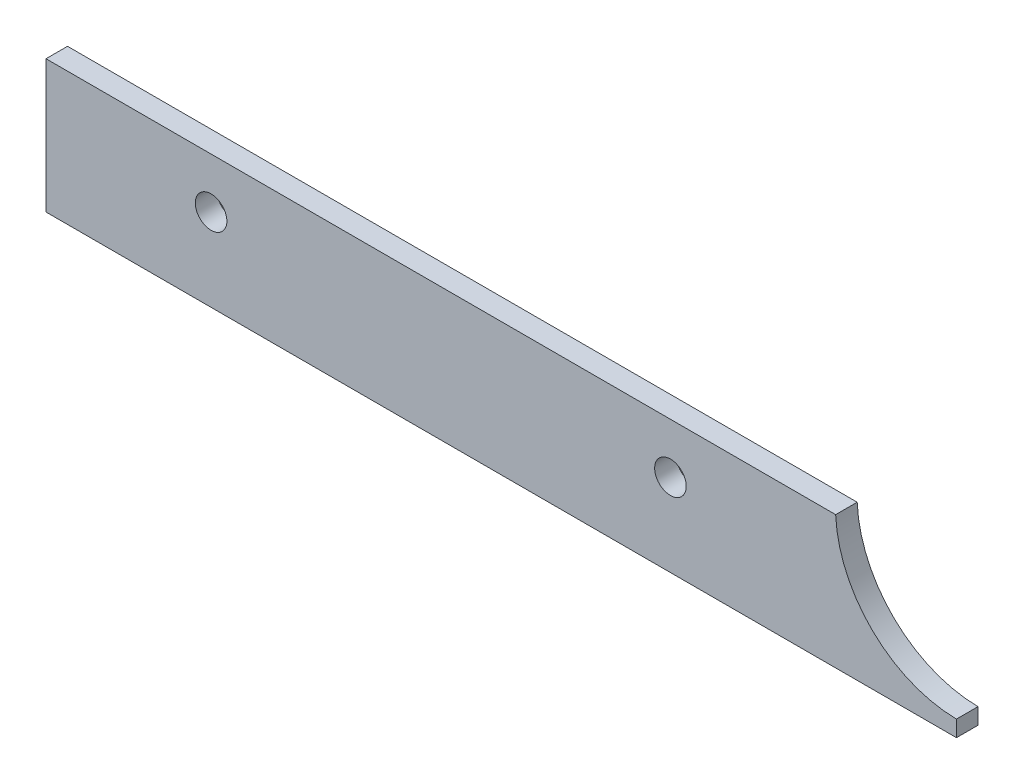
ISO-10303-21;
HEADER;
FILE_DESCRIPTION(('STEP AP214'),'2;1');
FILE_NAME('part.step','',(''),(''),'','','');
FILE_SCHEMA(('AUTOMOTIVE_DESIGN { 1 0 10303 214 1 1 1 1 }'));
ENDSEC;
DATA;
#1=APPLICATION_CONTEXT('core data for automotive mechanical design processes');
#2=APPLICATION_PROTOCOL_DEFINITION('international standard','automotive_design',2000,#1);
#3=PRODUCT_CONTEXT('',#1,'mechanical');
#4=PRODUCT('Part','Part','',(#3));
#5=PRODUCT_RELATED_PRODUCT_CATEGORY('part','',(#4));
#6=PRODUCT_DEFINITION_FORMATION('','',#4);
#7=PRODUCT_DEFINITION_CONTEXT('part definition',#1,'design');
#8=PRODUCT_DEFINITION('design','',#6,#7);
#9=PRODUCT_DEFINITION_SHAPE('','',#8);
#10=(LENGTH_UNIT() NAMED_UNIT(*) SI_UNIT(.MILLI.,.METRE.));
#11=(NAMED_UNIT(*) PLANE_ANGLE_UNIT() SI_UNIT($,.RADIAN.));
#12=(NAMED_UNIT(*) SI_UNIT($,.STERADIAN.) SOLID_ANGLE_UNIT());
#13=UNCERTAINTY_MEASURE_WITH_UNIT(LENGTH_MEASURE(1.E-05),#10,'distance_accuracy_value','');
#14=(GEOMETRIC_REPRESENTATION_CONTEXT(3) GLOBAL_UNCERTAINTY_ASSIGNED_CONTEXT((#13)) GLOBAL_UNIT_ASSIGNED_CONTEXT((#10,
#11,#12)) REPRESENTATION_CONTEXT('',''));
#15=CARTESIAN_POINT('',(0.,0.,0.));
#16=DIRECTION('',(0.,0.,1.));
#17=DIRECTION('',(1.,0.,0.));
#18=AXIS2_PLACEMENT_3D('',#15,#16,#17);
#19=CARTESIAN_POINT('',(-127.,9.25,0.));
#20=DIRECTION('',(0.,1.,0.));
#21=DIRECTION('',(1.,0.,0.));
#22=AXIS2_PLACEMENT_3D('',#19,#20,#21);
#23=PLANE('',#22);
#24=DIRECTION('',(0.,0.,1.));
#25=VECTOR('',#24,1.);
#26=CARTESIAN_POINT('',(-127.,9.25,0.));
#27=LINE('',#26,#25);
#28=CARTESIAN_POINT('',(-127.,9.25,0.));
#29=VERTEX_POINT('',#28);
#30=CARTESIAN_POINT('',(-127.,9.25,3.));
#31=VERTEX_POINT('',#30);
#32=EDGE_CURVE('E154',#29,#31,#27,.T.);
#33=ORIENTED_EDGE('',*,*,#32,.T.);
#34=DIRECTION('',(1.,0.,0.));
#35=VECTOR('',#34,1.);
#36=CARTESIAN_POINT('',(-127.,9.25,3.));
#37=LINE('',#36,#35);
#38=CARTESIAN_POINT('',(-16.98344782427,9.25,3.));
#39=VERTEX_POINT('',#38);
#40=EDGE_CURVE('E137',#31,#39,#37,.T.);
#41=ORIENTED_EDGE('',*,*,#40,.T.);
#42=DIRECTION('',(0.,0.,1.));
#43=VECTOR('',#42,1.);
#44=CARTESIAN_POINT('',(-16.98344782427,9.25,0.));
#45=LINE('',#44,#43);
#46=CARTESIAN_POINT('',(-16.98344782427,9.25,0.));
#47=VERTEX_POINT('',#46);
#48=EDGE_CURVE('E11',#47,#39,#45,.T.);
#49=ORIENTED_EDGE('',*,*,#48,.F.);
#50=DIRECTION('',(1.,0.,0.));
#51=VECTOR('',#50,1.);
#52=CARTESIAN_POINT('',(-127.,9.25,0.));
#53=LINE('',#52,#51);
#54=EDGE_CURVE('E132',#29,#47,#53,.T.);
#55=ORIENTED_EDGE('',*,*,#54,.F.);
#56=EDGE_LOOP('',(#33,#41,#49,#55));
#57=FACE_BOUND('',#56,.T.);
#58=ADVANCED_FACE('F17',(#57),#23,.T.);
#59=CARTESIAN_POINT('',(0.,10.,0.));
#60=DIRECTION('',(0.,0.,-1.));
#61=DIRECTION('',(1.,0.,0.));
#62=AXIS2_PLACEMENT_3D('',#59,#60,#61);
#63=CYLINDRICAL_SURFACE('',#62,17.);
#64=ORIENTED_EDGE('',*,*,#48,.T.);
#65=CARTESIAN_POINT('',(0.,10.,3.));
#66=DIRECTION('',(0.,0.,1.));
#67=DIRECTION('',(1.,0.,0.));
#68=AXIS2_PLACEMENT_3D('',#65,#66,#67);
#69=CIRCLE('',#68,17.);
#70=CARTESIAN_POINT('',(-0.15,-6.999338222413,3.));
#71=VERTEX_POINT('',#70);
#72=EDGE_CURVE('E116',#39,#71,#69,.T.);
#73=ORIENTED_EDGE('',*,*,#72,.T.);
#74=DIRECTION('',(0.,0.,1.));
#75=VECTOR('',#74,1.);
#76=CARTESIAN_POINT('',(-0.15,-6.999338222413,0.));
#77=LINE('',#76,#75);
#78=CARTESIAN_POINT('',(-0.15,-6.999338222413,0.));
#79=VERTEX_POINT('',#78);
#80=EDGE_CURVE('E20',#79,#71,#77,.T.);
#81=ORIENTED_EDGE('',*,*,#80,.F.);
#82=CARTESIAN_POINT('',(0.,10.,0.));
#83=DIRECTION('',(0.,0.,1.));
#84=DIRECTION('',(1.,0.,0.));
#85=AXIS2_PLACEMENT_3D('',#82,#83,#84);
#86=CIRCLE('',#85,17.);
#87=EDGE_CURVE('E122',#47,#79,#86,.T.);
#88=ORIENTED_EDGE('',*,*,#87,.F.);
#89=EDGE_LOOP('',(#64,#73,#81,#88));
#90=FACE_BOUND('',#89,.T.);
#91=ADVANCED_FACE('F168',(#90),#63,.F.);
#92=CARTESIAN_POINT('',(-0.15,-6.999338222413,0.));
#93=DIRECTION('',(1.,0.,0.));
#94=DIRECTION('',(0.,1.,0.));
#95=AXIS2_PLACEMENT_3D('',#92,#93,#94);
#96=PLANE('',#95);
#97=ORIENTED_EDGE('',*,*,#80,.T.);
#98=DIRECTION('',(0.,-1.,0.));
#99=VECTOR('',#98,1.);
#100=CARTESIAN_POINT('',(-0.15,-6.999338222413,3.));
#101=LINE('',#100,#99);
#102=CARTESIAN_POINT('',(-0.15,-9.25,3.));
#103=VERTEX_POINT('',#102);
#104=EDGE_CURVE('E114',#71,#103,#101,.T.);
#105=ORIENTED_EDGE('',*,*,#104,.T.);
#106=DIRECTION('',(0.,0.,1.));
#107=VECTOR('',#106,1.);
#108=CARTESIAN_POINT('',(-0.15,-9.25,0.));
#109=LINE('',#108,#107);
#110=CARTESIAN_POINT('',(-0.15,-9.25,0.));
#111=VERTEX_POINT('',#110);
#112=EDGE_CURVE('E48',#111,#103,#109,.T.);
#113=ORIENTED_EDGE('',*,*,#112,.F.);
#114=DIRECTION('',(0.,-1.,0.));
#115=VECTOR('',#114,1.);
#116=CARTESIAN_POINT('',(-0.15,-6.999338222413,0.));
#117=LINE('',#116,#115);
#118=EDGE_CURVE('E119',#79,#111,#117,.T.);
#119=ORIENTED_EDGE('',*,*,#118,.F.);
#120=EDGE_LOOP('',(#97,#105,#113,#119));
#121=FACE_BOUND('',#120,.T.);
#122=ADVANCED_FACE('F162',(#121),#96,.T.);
#123=CARTESIAN_POINT('',(-0.15,-9.25,0.));
#124=DIRECTION('',(0.,-1.,0.));
#125=DIRECTION('',(0.,0.,-1.));
#126=AXIS2_PLACEMENT_3D('',#123,#124,#125);
#127=PLANE('',#126);
#128=ORIENTED_EDGE('',*,*,#112,.T.);
#129=DIRECTION('',(-1.,0.,0.));
#130=VECTOR('',#129,1.);
#131=CARTESIAN_POINT('',(-0.15,-9.25,3.));
#132=LINE('',#131,#130);
#133=CARTESIAN_POINT('',(-127.,-9.25,3.));
#134=VERTEX_POINT('',#133);
#135=EDGE_CURVE('E117',#103,#134,#132,.T.);
#136=ORIENTED_EDGE('',*,*,#135,.T.);
#137=DIRECTION('',(0.,0.,1.));
#138=VECTOR('',#137,1.);
#139=CARTESIAN_POINT('',(-127.,-9.25,0.));
#140=LINE('',#139,#138);
#141=CARTESIAN_POINT('',(-127.,-9.25,0.));
#142=VERTEX_POINT('',#141);
#143=EDGE_CURVE('E38',#142,#134,#140,.T.);
#144=ORIENTED_EDGE('',*,*,#143,.F.);
#145=DIRECTION('',(-1.,0.,0.));
#146=VECTOR('',#145,1.);
#147=CARTESIAN_POINT('',(-0.15,-9.25,0.));
#148=LINE('',#147,#146);
#149=EDGE_CURVE('E113',#111,#142,#148,.T.);
#150=ORIENTED_EDGE('',*,*,#149,.F.);
#151=EDGE_LOOP('',(#128,#136,#144,#150));
#152=FACE_BOUND('',#151,.T.);
#153=ADVANCED_FACE('F174',(#152),#127,.T.);
#154=CARTESIAN_POINT('',(-127.,-9.25,0.));
#155=DIRECTION('',(-1.,0.,0.));
#156=DIRECTION('',(0.,0.,1.));
#157=AXIS2_PLACEMENT_3D('',#154,#155,#156);
#158=PLANE('',#157);
#159=ORIENTED_EDGE('',*,*,#143,.T.);
#160=DIRECTION('',(0.,1.,0.));
#161=VECTOR('',#160,1.);
#162=CARTESIAN_POINT('',(-127.,-9.25,3.));
#163=LINE('',#162,#161);
#164=EDGE_CURVE('E106',#134,#31,#163,.T.);
#165=ORIENTED_EDGE('',*,*,#164,.T.);
#166=ORIENTED_EDGE('',*,*,#32,.F.);
#167=DIRECTION('',(0.,1.,0.));
#168=VECTOR('',#167,1.);
#169=CARTESIAN_POINT('',(-127.,-9.25,0.));
#170=LINE('',#169,#168);
#171=EDGE_CURVE('E109',#142,#29,#170,.T.);
#172=ORIENTED_EDGE('',*,*,#171,.F.);
#173=EDGE_LOOP('',(#159,#165,#166,#172));
#174=FACE_BOUND('',#173,.T.);
#175=ADVANCED_FACE('F176',(#174),#158,.T.);
#176=CARTESIAN_POINT('',(-40.,2.25,0.));
#177=DIRECTION('',(0.,0.,-1.));
#178=DIRECTION('',(1.,0.,0.));
#179=AXIS2_PLACEMENT_3D('',#176,#177,#178);
#180=CYLINDRICAL_SURFACE('',#179,2.2);
#181=CARTESIAN_POINT('',(-40.,2.25,0.));
#182=DIRECTION('',(0.,0.,1.));
#183=DIRECTION('',(1.,0.,0.));
#184=AXIS2_PLACEMENT_3D('',#181,#182,#183);
#185=CIRCLE('',#184,2.2);
#186=CARTESIAN_POINT('',(-37.8,2.25,0.));
#187=VERTEX_POINT('',#186);
#188=EDGE_CURVE('E129',#187,#187,#185,.T.);
#189=ORIENTED_EDGE('',*,*,#188,.F.);
#190=EDGE_LOOP('',(#189));
#191=FACE_BOUND('',#190,.T.);
#192=CARTESIAN_POINT('',(-40.,2.25,3.));
#193=DIRECTION('',(0.,0.,1.));
#194=DIRECTION('',(1.,0.,0.));
#195=AXIS2_PLACEMENT_3D('',#192,#193,#194);
#196=CIRCLE('',#195,2.2);
#197=CARTESIAN_POINT('',(-37.8,2.25,3.));
#198=VERTEX_POINT('',#197);
#199=EDGE_CURVE('E100',#198,#198,#196,.T.);
#200=ORIENTED_EDGE('',*,*,#199,.T.);
#201=EDGE_LOOP('',(#200));
#202=FACE_BOUND('',#201,.T.);
#203=ADVANCED_FACE('F184',(#191,#202),#180,.F.);
#204=CARTESIAN_POINT('',(-104.,2.25,0.));
#205=DIRECTION('',(0.,0.,-1.));
#206=DIRECTION('',(1.,0.,0.));
#207=AXIS2_PLACEMENT_3D('',#204,#205,#206);
#208=CYLINDRICAL_SURFACE('',#207,2.2);
#209=CARTESIAN_POINT('',(-104.,2.25,0.));
#210=DIRECTION('',(0.,0.,1.));
#211=DIRECTION('',(1.,0.,0.));
#212=AXIS2_PLACEMENT_3D('',#209,#210,#211);
#213=CIRCLE('',#212,2.2);
#214=CARTESIAN_POINT('',(-101.8,2.25,0.));
#215=VERTEX_POINT('',#214);
#216=EDGE_CURVE('E133',#215,#215,#213,.T.);
#217=ORIENTED_EDGE('',*,*,#216,.F.);
#218=EDGE_LOOP('',(#217));
#219=FACE_BOUND('',#218,.T.);
#220=CARTESIAN_POINT('',(-104.,2.25,3.));
#221=DIRECTION('',(0.,0.,1.));
#222=DIRECTION('',(1.,0.,0.));
#223=AXIS2_PLACEMENT_3D('',#220,#221,#222);
#224=CIRCLE('',#223,2.2);
#225=CARTESIAN_POINT('',(-101.8,2.25,3.));
#226=VERTEX_POINT('',#225);
#227=EDGE_CURVE('E96',#226,#226,#224,.T.);
#228=ORIENTED_EDGE('',*,*,#227,.T.);
#229=EDGE_LOOP('',(#228));
#230=FACE_BOUND('',#229,.T.);
#231=ADVANCED_FACE('F97',(#219,#230),#208,.F.);
#232=CARTESIAN_POINT('',(-66.16857533419,-0.47163410011,0.));
#233=DIRECTION('',(0.,0.,1.));
#234=DIRECTION('',(1.,0.,0.));
#235=AXIS2_PLACEMENT_3D('',#232,#233,#234);
#236=PLANE('',#235);
#237=ORIENTED_EDGE('',*,*,#54,.T.);
#238=ORIENTED_EDGE('',*,*,#87,.T.);
#239=ORIENTED_EDGE('',*,*,#118,.T.);
#240=ORIENTED_EDGE('',*,*,#149,.T.);
#241=ORIENTED_EDGE('',*,*,#171,.T.);
#242=EDGE_LOOP('',(#237,#238,#239,#240,#241));
#243=FACE_BOUND('',#242,.T.);
#244=ORIENTED_EDGE('',*,*,#188,.T.);
#245=EDGE_LOOP('',(#244));
#246=FACE_BOUND('',#245,.T.);
#247=ORIENTED_EDGE('',*,*,#216,.T.);
#248=EDGE_LOOP('',(#247));
#249=FACE_BOUND('',#248,.T.);
#250=ADVANCED_FACE('F197',(#243,#246,#249),#236,.F.);
#251=CARTESIAN_POINT('',(-66.16857533419,-0.47163410011,3.));
#252=DIRECTION('',(0.,0.,1.));
#253=DIRECTION('',(1.,0.,0.));
#254=AXIS2_PLACEMENT_3D('',#251,#252,#253);
#255=PLANE('',#254);
#256=ORIENTED_EDGE('',*,*,#164,.F.);
#257=ORIENTED_EDGE('',*,*,#135,.F.);
#258=ORIENTED_EDGE('',*,*,#104,.F.);
#259=ORIENTED_EDGE('',*,*,#72,.F.);
#260=ORIENTED_EDGE('',*,*,#40,.F.);
#261=EDGE_LOOP('',(#256,#257,#258,#259,#260));
#262=FACE_BOUND('',#261,.T.);
#263=ORIENTED_EDGE('',*,*,#199,.F.);
#264=EDGE_LOOP('',(#263));
#265=FACE_BOUND('',#264,.T.);
#266=ORIENTED_EDGE('',*,*,#227,.F.);
#267=EDGE_LOOP('',(#266));
#268=FACE_BOUND('',#267,.T.);
#269=ADVANCED_FACE('F172',(#262,#265,#268),#255,.T.);
#270=CLOSED_SHELL('',(#58,#91,#122,#153,#175,#203,#231,#250,#269));
#271=MANIFOLD_SOLID_BREP('B1',#270);
#272=ADVANCED_BREP_SHAPE_REPRESENTATION('',(#18,#271),#14);
#273=SHAPE_DEFINITION_REPRESENTATION(#9,#272);
ENDSEC;
END-ISO-10303-21;
